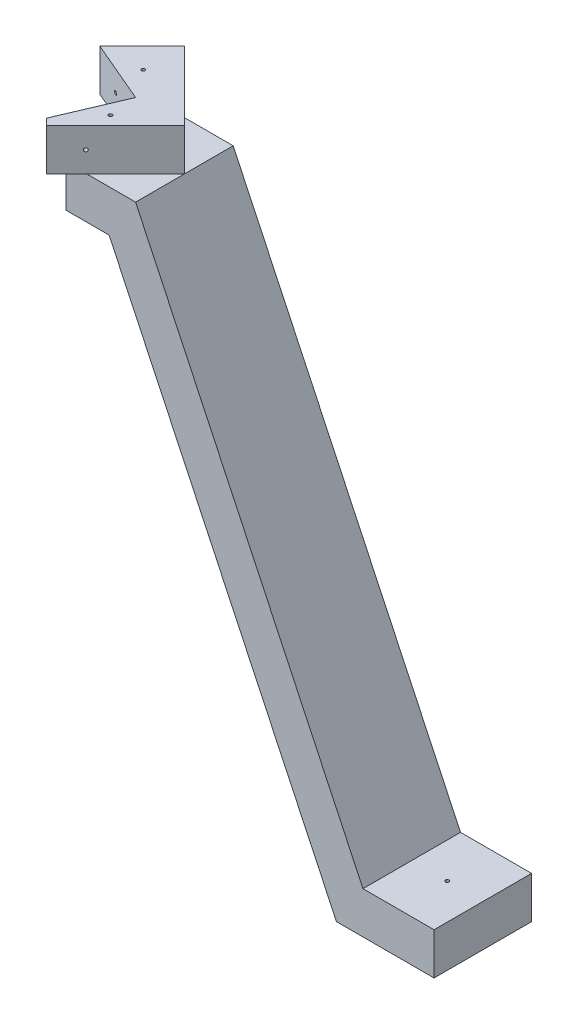
ISO-10303-21;
HEADER;
FILE_DESCRIPTION(('STEP AP214'),'2;1');
FILE_NAME('part.step','',(''),(''),'','','');
FILE_SCHEMA(('AUTOMOTIVE_DESIGN { 1 0 10303 214 1 1 1 1 }'));
ENDSEC;
DATA;
#1=APPLICATION_CONTEXT('core data for automotive mechanical design processes');
#2=APPLICATION_PROTOCOL_DEFINITION('international standard','automotive_design',2000,#1);
#3=PRODUCT_CONTEXT('',#1,'mechanical');
#4=PRODUCT('Part','Part','',(#3));
#5=PRODUCT_RELATED_PRODUCT_CATEGORY('part','',(#4));
#6=PRODUCT_DEFINITION_FORMATION('','',#4);
#7=PRODUCT_DEFINITION_CONTEXT('part definition',#1,'design');
#8=PRODUCT_DEFINITION('design','',#6,#7);
#9=PRODUCT_DEFINITION_SHAPE('','',#8);
#10=(LENGTH_UNIT() NAMED_UNIT(*) SI_UNIT(.MILLI.,.METRE.));
#11=(NAMED_UNIT(*) PLANE_ANGLE_UNIT() SI_UNIT($,.RADIAN.));
#12=(NAMED_UNIT(*) SI_UNIT($,.STERADIAN.) SOLID_ANGLE_UNIT());
#13=UNCERTAINTY_MEASURE_WITH_UNIT(LENGTH_MEASURE(1.E-05),#10,'distance_accuracy_value','');
#14=(GEOMETRIC_REPRESENTATION_CONTEXT(3) GLOBAL_UNCERTAINTY_ASSIGNED_CONTEXT((#13)) GLOBAL_UNIT_ASSIGNED_CONTEXT((#10,
#11,#12)) REPRESENTATION_CONTEXT('',''));
#15=CARTESIAN_POINT('',(0.,0.,0.));
#16=DIRECTION('',(0.,0.,1.));
#17=DIRECTION('',(1.,0.,0.));
#18=AXIS2_PLACEMENT_3D('',#15,#16,#17);
#19=CARTESIAN_POINT('',(-183.025944468659,476.25,44.4499999999994));
#20=DIRECTION('',(0.,-1.,0.));
#21=DIRECTION('',(0.,0.,-0.999999999999999));
#22=AXIS2_PLACEMENT_3D('',#19,#20,#21);
#23=PLANE('',#22);
#24=DIRECTION('',(-0.707106781186549,0.,0.707106781186546));
#25=VECTOR('',#24,1.);
#26=CARTESIAN_POINT('',(-308.749530163627,476.25,-2.4980018054066E-13));
#27=LINE('',#26,#25);
#28=CARTESIAN_POINT('',(-264.299530163627,476.25,-44.45));
#29=VERTEX_POINT('',#28);
#30=CARTESIAN_POINT('',(-271.925944468659,476.25,-36.8235856949682));
#31=VERTEX_POINT('',#30);
#32=EDGE_CURVE('E50',#29,#31,#27,.T.);
#33=ORIENTED_EDGE('',*,*,#32,.F.);
#34=DIRECTION('',(-0.999999999999999,0.,0.));
#35=VECTOR('',#34,1.);
#36=CARTESIAN_POINT('',(-183.025944468659,476.25,-44.45));
#37=LINE('',#36,#35);
#38=CARTESIAN_POINT('',(-271.925944468659,476.25,-44.45));
#39=VERTEX_POINT('',#38);
#40=EDGE_CURVE('E253',#29,#39,#37,.T.);
#41=ORIENTED_EDGE('',*,*,#40,.T.);
#42=DIRECTION('',(0.,0.,-0.999999999999999));
#43=VECTOR('',#42,1.);
#44=CARTESIAN_POINT('',(-271.925944468659,476.25,44.4499999999997));
#45=LINE('',#44,#43);
#46=EDGE_CURVE('E270',#31,#39,#45,.T.);
#47=ORIENTED_EDGE('',*,*,#46,.F.);
#48=EDGE_LOOP('',(#33,#41,#47));
#49=FACE_BOUND('',#48,.T.);
#50=ADVANCED_FACE('F36',(#49),#23,.F.);
#51=DIRECTION('',(-0.707106781186549,0.,-0.707106781186545));
#52=VECTOR('',#51,1.);
#53=CARTESIAN_POINT('',(-245.887737316143,476.25,-62.8617928474839));
#54=LINE('',#53,#52);
#55=CARTESIAN_POINT('',(-183.025944468659,476.25,-1.94289029309402E-13));
#56=VERTEX_POINT('',#55);
#57=CARTESIAN_POINT('',(-227.475944468659,476.25,-44.4500000000003));
#58=VERTEX_POINT('',#57);
#59=EDGE_CURVE('E66',#56,#58,#54,.T.);
#60=ORIENTED_EDGE('',*,*,#59,.F.);
#61=DIRECTION('',(0.,0.,-0.999999999999999));
#62=VECTOR('',#61,1.);
#63=CARTESIAN_POINT('',(-183.025944468659,476.25,44.4499999999994));
#64=LINE('',#63,#62);
#65=CARTESIAN_POINT('',(-183.025944468659,476.25,-44.45));
#66=VERTEX_POINT('',#65);
#67=EDGE_CURVE('E273',#56,#66,#64,.T.);
#68=ORIENTED_EDGE('',*,*,#67,.T.);
#69=EDGE_CURVE('E254',#66,#58,#37,.T.);
#70=ORIENTED_EDGE('',*,*,#69,.T.);
#71=EDGE_LOOP('',(#60,#68,#70));
#72=FACE_BOUND('',#71,.T.);
#73=ADVANCED_FACE('F370',(#72),#23,.F.);
#74=DIRECTION('',(0.707106781186549,0.,-0.707106781186546));
#75=VECTOR('',#74,1.);
#76=CARTESIAN_POINT('',(-183.025944468659,476.25,-3.05311331771918E-13));
#77=LINE('',#76,#75);
#78=CARTESIAN_POINT('',(-227.475944468659,476.25,44.4499999999997));
#79=VERTEX_POINT('',#78);
#80=EDGE_CURVE('E209',#79,#56,#77,.T.);
#81=ORIENTED_EDGE('',*,*,#80,.F.);
#82=DIRECTION('',(-0.999999999999999,0.,0.));
#83=VECTOR('',#82,1.);
#84=CARTESIAN_POINT('',(-183.025944468659,476.25,44.4499999999994));
#85=LINE('',#84,#83);
#86=CARTESIAN_POINT('',(-183.025944468659,476.25,44.4499999999994));
#87=VERTEX_POINT('',#86);
#88=EDGE_CURVE('E237',#87,#79,#85,.T.);
#89=ORIENTED_EDGE('',*,*,#88,.F.);
#90=EDGE_CURVE('E274',#87,#56,#64,.T.);
#91=ORIENTED_EDGE('',*,*,#90,.T.);
#92=EDGE_LOOP('',(#81,#89,#91));
#93=FACE_BOUND('',#92,.T.);
#94=ADVANCED_FACE('F365',(#93),#23,.F.);
#95=CARTESIAN_POINT('',(88.9,0.,44.45));
#96=DIRECTION('',(0.,1.,0.));
#97=DIRECTION('',(0.,0.,0.999999999999999));
#98=AXIS2_PLACEMENT_3D('',#95,#96,#97);
#99=PLANE('',#98);
#100=CARTESIAN_POINT('',(56.5151055313409,0.,0.));
#101=DIRECTION('',(0.,1.,0.));
#102=DIRECTION('',(0.,0.,0.999999999999999));
#103=AXIS2_PLACEMENT_3D('',#100,#101,#102);
#104=CIRCLE('',#103,1.58749999999999);
#105=CARTESIAN_POINT('',(56.5151055313409,0.,1.58749999999993));
#106=VERTEX_POINT('',#105);
#107=EDGE_CURVE('E222',#106,#106,#104,.T.);
#108=ORIENTED_EDGE('',*,*,#107,.T.);
#109=EDGE_LOOP('',(#108));
#110=FACE_BOUND('',#109,.T.);
#111=DIRECTION('',(0.999999999999999,0.,0.));
#112=VECTOR('',#111,1.);
#113=CARTESIAN_POINT('',(88.9,0.,-44.45));
#114=LINE('',#113,#112);
#115=CARTESIAN_POINT('',(2.22044604925031E-13,0.,-44.45));
#116=VERTEX_POINT('',#115);
#117=CARTESIAN_POINT('',(88.9,0.,-44.45));
#118=VERTEX_POINT('',#117);
#119=EDGE_CURVE('E225',#116,#118,#114,.T.);
#120=ORIENTED_EDGE('',*,*,#119,.T.);
#121=DIRECTION('',(0.,0.,-0.999999999999999));
#122=VECTOR('',#121,1.);
#123=CARTESIAN_POINT('',(88.9,0.,44.45));
#124=LINE('',#123,#122);
#125=CARTESIAN_POINT('',(88.9,0.,44.45));
#126=VERTEX_POINT('',#125);
#127=EDGE_CURVE('E283',#126,#118,#124,.T.);
#128=ORIENTED_EDGE('',*,*,#127,.F.);
#129=DIRECTION('',(0.999999999999999,0.,0.));
#130=VECTOR('',#129,1.);
#131=CARTESIAN_POINT('',(88.9,0.,44.45));
#132=LINE('',#131,#130);
#133=CARTESIAN_POINT('',(1.11022302462516E-13,0.,44.4499999999998));
#134=VERTEX_POINT('',#133);
#135=EDGE_CURVE('E226',#134,#126,#132,.T.);
#136=ORIENTED_EDGE('',*,*,#135,.F.);
#137=DIRECTION('',(0.,0.,-0.999999999999999));
#138=VECTOR('',#137,1.);
#139=CARTESIAN_POINT('',(1.11022302462516E-13,0.,44.4499999999998));
#140=LINE('',#139,#138);
#141=EDGE_CURVE('E243',#134,#116,#140,.T.);
#142=ORIENTED_EDGE('',*,*,#141,.T.);
#143=EDGE_LOOP('',(#120,#128,#136,#142));
#144=FACE_BOUND('',#143,.T.);
#145=ADVANCED_FACE('F38',(#110,#144),#99,.F.);
#146=CARTESIAN_POINT('',(88.9,38.0999999999997,44.45));
#147=DIRECTION('',(-0.999999999999999,0.,0.));
#148=DIRECTION('',(0.,0.,0.999999999999999));
#149=AXIS2_PLACEMENT_3D('',#146,#147,#148);
#150=PLANE('',#149);
#151=DIRECTION('',(0.,1.,0.));
#152=VECTOR('',#151,1.);
#153=CARTESIAN_POINT('',(88.9,38.0999999999997,-44.45));
#154=LINE('',#153,#152);
#155=CARTESIAN_POINT('',(88.9,38.0999999999997,-44.45));
#156=VERTEX_POINT('',#155);
#157=EDGE_CURVE('E246',#118,#156,#154,.T.);
#158=ORIENTED_EDGE('',*,*,#157,.T.);
#159=DIRECTION('',(0.,0.,-0.999999999999999));
#160=VECTOR('',#159,1.);
#161=CARTESIAN_POINT('',(88.9,38.0999999999997,44.45));
#162=LINE('',#161,#160);
#163=CARTESIAN_POINT('',(88.9,38.0999999999997,44.45));
#164=VERTEX_POINT('',#163);
#165=EDGE_CURVE('E280',#164,#156,#162,.T.);
#166=ORIENTED_EDGE('',*,*,#165,.F.);
#167=DIRECTION('',(0.,1.,0.));
#168=VECTOR('',#167,1.);
#169=CARTESIAN_POINT('',(88.9,38.0999999999997,44.45));
#170=LINE('',#169,#168);
#171=EDGE_CURVE('E229',#126,#164,#170,.T.);
#172=ORIENTED_EDGE('',*,*,#171,.F.);
#173=ORIENTED_EDGE('',*,*,#127,.T.);
#174=EDGE_LOOP('',(#158,#166,#172,#173));
#175=FACE_BOUND('',#174,.T.);
#176=ADVANCED_FACE('F402',(#175),#150,.F.);
#177=CARTESIAN_POINT('',(24.1302110626818,38.1,44.45));
#178=DIRECTION('',(0.,-1.,0.));
#179=DIRECTION('',(0.,0.,-0.999999999999999));
#180=AXIS2_PLACEMENT_3D('',#177,#178,#179);
#181=PLANE('',#180);
#182=CARTESIAN_POINT('',(56.5151055313409,38.0999999999997,0.));
#183=DIRECTION('',(0.,1.,0.));
#184=DIRECTION('',(0.,0.,0.999999999999999));
#185=AXIS2_PLACEMENT_3D('',#182,#183,#184);
#186=CIRCLE('',#185,1.58749999999999);
#187=CARTESIAN_POINT('',(56.5151055313409,38.0999999999997,1.58749999999993));
#188=VERTEX_POINT('',#187);
#189=EDGE_CURVE('E219',#188,#188,#186,.T.);
#190=ORIENTED_EDGE('',*,*,#189,.F.);
#191=EDGE_LOOP('',(#190));
#192=FACE_BOUND('',#191,.T.);
#193=DIRECTION('',(-0.999999999999999,0.,0.));
#194=VECTOR('',#193,1.);
#195=CARTESIAN_POINT('',(24.1302110626818,38.1,-44.45));
#196=LINE('',#195,#194);
#197=CARTESIAN_POINT('',(24.1302110626818,38.1,-44.45));
#198=VERTEX_POINT('',#197);
#199=EDGE_CURVE('E248',#156,#198,#196,.T.);
#200=ORIENTED_EDGE('',*,*,#199,.T.);
#201=DIRECTION('',(0.,0.,-0.999999999999999));
#202=VECTOR('',#201,1.);
#203=CARTESIAN_POINT('',(24.1302110626818,38.1,44.45));
#204=LINE('',#203,#202);
#205=CARTESIAN_POINT('',(24.1302110626818,38.1,44.45));
#206=VERTEX_POINT('',#205);
#207=EDGE_CURVE('E277',#206,#198,#204,.T.);
#208=ORIENTED_EDGE('',*,*,#207,.F.);
#209=DIRECTION('',(-0.999999999999999,0.,0.));
#210=VECTOR('',#209,1.);
#211=CARTESIAN_POINT('',(24.1302110626818,38.1,44.45));
#212=LINE('',#211,#210);
#213=EDGE_CURVE('E232',#164,#206,#212,.T.);
#214=ORIENTED_EDGE('',*,*,#213,.F.);
#215=ORIENTED_EDGE('',*,*,#165,.T.);
#216=EDGE_LOOP('',(#200,#208,#214,#215));
#217=FACE_BOUND('',#216,.T.);
#218=ADVANCED_FACE('F407',(#192,#217),#181,.F.);
#219=CARTESIAN_POINT('',(-183.025944468659,476.25,44.4499999999994));
#220=DIRECTION('',(-0.904047789169114,-0.427431392036704,0.));
#221=DIRECTION('',(0.427431392036705,-0.904047789169115,0.));
#222=AXIS2_PLACEMENT_3D('',#219,#220,#221);
#223=PLANE('',#222);
#224=DIRECTION('',(-0.427431392036705,0.904047789169115,0.));
#225=VECTOR('',#224,1.);
#226=CARTESIAN_POINT('',(-183.025944468659,476.25,-44.45));
#227=LINE('',#226,#225);
#228=EDGE_CURVE('E250',#198,#66,#227,.T.);
#229=ORIENTED_EDGE('',*,*,#228,.T.);
#230=ORIENTED_EDGE('',*,*,#67,.F.);
#231=ORIENTED_EDGE('',*,*,#90,.F.);
#232=DIRECTION('',(-0.427431392036705,0.904047789169115,0.));
#233=VECTOR('',#232,1.);
#234=CARTESIAN_POINT('',(-183.025944468659,476.25,44.4499999999994));
#235=LINE('',#234,#233);
#236=EDGE_CURVE('E234',#206,#87,#235,.T.);
#237=ORIENTED_EDGE('',*,*,#236,.F.);
#238=ORIENTED_EDGE('',*,*,#207,.T.);
#239=EDGE_LOOP('',(#229,#230,#231,#237,#238));
#240=FACE_BOUND('',#239,.T.);
#241=ADVANCED_FACE('F367',(#240),#223,.F.);
#242=CARTESIAN_POINT('',(-271.925944468659,476.25,44.4499999999997));
#243=DIRECTION('',(0.999999999999999,0.,0.));
#244=DIRECTION('',(0.,1.,0.));
#245=AXIS2_PLACEMENT_3D('',#242,#243,#244);
#246=PLANE('',#245);
#247=DIRECTION('',(0.,0.,-0.999999999999999));
#248=VECTOR('',#247,1.);
#249=CARTESIAN_POINT('',(-271.925944468659,438.15,44.4499999999995));
#250=LINE('',#249,#248);
#251=CARTESIAN_POINT('',(-271.925944468659,438.15,-18.9769560653855));
#252=VERTEX_POINT('',#251);
#253=CARTESIAN_POINT('',(-271.925944468659,438.15,-44.4500000000001));
#254=VERTEX_POINT('',#253);
#255=EDGE_CURVE('E268',#252,#254,#250,.T.);
#256=ORIENTED_EDGE('',*,*,#255,.F.);
#257=DIRECTION('',(0.,1.,0.));
#258=VECTOR('',#257,1.);
#259=CARTESIAN_POINT('',(-271.925944468659,476.25,-18.9769560653854));
#260=LINE('',#259,#258);
#261=CARTESIAN_POINT('',(-271.925944468659,476.25,-18.9769560653852));
#262=VERTEX_POINT('',#261);
#263=EDGE_CURVE('E167',#252,#262,#260,.T.);
#264=ORIENTED_EDGE('',*,*,#263,.T.);
#265=EDGE_CURVE('E271',#262,#31,#45,.T.);
#266=ORIENTED_EDGE('',*,*,#265,.T.);
#267=ORIENTED_EDGE('',*,*,#46,.T.);
#268=DIRECTION('',(0.,-1.,0.));
#269=VECTOR('',#268,1.);
#270=CARTESIAN_POINT('',(-271.925944468659,476.25,-44.45));
#271=LINE('',#270,#269);
#272=EDGE_CURVE('E256',#39,#254,#271,.T.);
#273=ORIENTED_EDGE('',*,*,#272,.T.);
#274=EDGE_LOOP('',(#256,#264,#266,#267,#273));
#275=FACE_BOUND('',#274,.T.);
#276=ADVANCED_FACE('F342',(#275),#246,.F.);
#277=CARTESIAN_POINT('',(-271.925944468659,438.15,44.4499999999995));
#278=DIRECTION('',(0.,1.,0.));
#279=DIRECTION('',(-0.999999999999999,0.,0.));
#280=AXIS2_PLACEMENT_3D('',#277,#278,#279);
#281=PLANE('',#280);
#282=CARTESIAN_POINT('',(-224.936155531341,438.15,25.3999999999997));
#283=DIRECTION('',(0.,-1.,0.));
#284=DIRECTION('',(0.,0.,-0.999999999999999));
#285=AXIS2_PLACEMENT_3D('',#282,#283,#284);
#286=CIRCLE('',#285,1.58749999999999);
#287=CARTESIAN_POINT('',(-224.936155531341,438.15,23.8124999999997));
#288=VERTEX_POINT('',#287);
#289=EDGE_CURVE('E516',#288,#288,#286,.T.);
#290=ORIENTED_EDGE('',*,*,#289,.F.);
#291=EDGE_LOOP('',(#290));
#292=FACE_BOUND('',#291,.T.);
#293=CARTESIAN_POINT('',(-245.887737316143,438.15,-25.4000000000002));
#294=DIRECTION('',(0.,-1.,0.));
#295=DIRECTION('',(0.,0.,-0.999999999999999));
#296=AXIS2_PLACEMENT_3D('',#293,#294,#295);
#297=CIRCLE('',#296,1.58749999999999);
#298=CARTESIAN_POINT('',(-245.887737316143,438.15,-26.9875000000002));
#299=VERTEX_POINT('',#298);
#300=EDGE_CURVE('E518',#299,#299,#297,.T.);
#301=ORIENTED_EDGE('',*,*,#300,.F.);
#302=EDGE_LOOP('',(#301));
#303=FACE_BOUND('',#302,.T.);
#304=DIRECTION('',(0.999999999999999,0.,0.));
#305=VECTOR('',#304,1.);
#306=CARTESIAN_POINT('',(-271.925944468659,438.15,44.4499999999995));
#307=LINE('',#306,#305);
#308=CARTESIAN_POINT('',(-246.452900534044,438.15,44.4499999999996));
#309=VERTEX_POINT('',#308);
#310=CARTESIAN_POINT('',(-207.156155531341,438.15,44.4499999999999));
#311=VERTEX_POINT('',#310);
#312=EDGE_CURVE('E181',#309,#311,#307,.T.);
#313=ORIENTED_EDGE('',*,*,#312,.F.);
#314=DIRECTION('',(0.392642119385448,0.,-0.919691342834378));
#315=VECTOR('',#314,1.);
#316=CARTESIAN_POINT('',(-250.380024540678,438.15,53.648559636931));
#317=LINE('',#316,#315);
#318=CARTESIAN_POINT('',(-227.475944468659,438.15,0.));
#319=VERTEX_POINT('',#318);
#320=EDGE_CURVE('E174',#309,#319,#317,.T.);
#321=ORIENTED_EDGE('',*,*,#320,.T.);
#322=DIRECTION('',(-0.91969134283438,0.,-0.392642119385445));
#323=VECTOR('',#322,1.);
#324=CARTESIAN_POINT('',(-249.02186439664,438.15,-9.19855963693189));
#325=LINE('',#324,#323);
#326=EDGE_CURVE('E163',#319,#252,#325,.T.);
#327=ORIENTED_EDGE('',*,*,#326,.T.);
#328=ORIENTED_EDGE('',*,*,#255,.T.);
#329=DIRECTION('',(0.999999999999999,0.,0.));
#330=VECTOR('',#329,1.);
#331=CARTESIAN_POINT('',(-271.925944468659,438.15,-44.4500000000001));
#332=LINE('',#331,#330);
#333=CARTESIAN_POINT('',(-207.156155531341,438.15,-44.4500000000003));
#334=VERTEX_POINT('',#333);
#335=EDGE_CURVE('E260',#254,#334,#332,.T.);
#336=ORIENTED_EDGE('',*,*,#335,.T.);
#337=DIRECTION('',(0.,0.,-0.999999999999999));
#338=VECTOR('',#337,1.);
#339=CARTESIAN_POINT('',(-207.156155531341,438.15,44.4499999999999));
#340=LINE('',#339,#338);
#341=EDGE_CURVE('E265',#311,#334,#340,.T.);
#342=ORIENTED_EDGE('',*,*,#341,.F.);
#343=EDGE_LOOP('',(#313,#321,#327,#328,#336,#342));
#344=FACE_BOUND('',#343,.T.);
#345=ADVANCED_FACE('F179',(#292,#303,#344),#281,.F.);
#346=CARTESIAN_POINT('',(1.11022302462516E-13,0.,44.4499999999998));
#347=DIRECTION('',(0.904047789169115,0.427431392036704,0.));
#348=DIRECTION('',(-0.427431392036705,0.904047789169115,0.));
#349=AXIS2_PLACEMENT_3D('',#346,#347,#348);
#350=PLANE('',#349);
#351=DIRECTION('',(0.427431392036705,-0.904047789169115,0.));
#352=VECTOR('',#351,1.);
#353=CARTESIAN_POINT('',(2.22044604925031E-13,0.,-44.45));
#354=LINE('',#353,#352);
#355=EDGE_CURVE('E230',#334,#116,#354,.T.);
#356=ORIENTED_EDGE('',*,*,#355,.T.);
#357=ORIENTED_EDGE('',*,*,#141,.F.);
#358=DIRECTION('',(0.427431392036705,-0.904047789169115,0.));
#359=VECTOR('',#358,1.);
#360=CARTESIAN_POINT('',(1.11022302462516E-13,0.,44.4499999999998));
#361=LINE('',#360,#359);
#362=EDGE_CURVE('E241',#311,#134,#361,.T.);
#363=ORIENTED_EDGE('',*,*,#362,.F.);
#364=ORIENTED_EDGE('',*,*,#341,.T.);
#365=EDGE_LOOP('',(#356,#357,#363,#364));
#366=FACE_BOUND('',#365,.T.);
#367=ADVANCED_FACE('F350',(#366),#350,.F.);
#368=CARTESIAN_POINT('',(1.11022302462516E-13,0.,44.4499999999998));
#369=DIRECTION('',(0.,0.,0.999999999999999));
#370=DIRECTION('',(0.999999999999999,0.,0.));
#371=AXIS2_PLACEMENT_3D('',#368,#369,#370);
#372=PLANE('',#371);
#373=DIRECTION('',(0.,1.,0.));
#374=VECTOR('',#373,1.);
#375=CARTESIAN_POINT('',(-246.452900534044,0.,44.4500000000001));
#376=LINE('',#375,#374);
#377=CARTESIAN_POINT('',(-246.452900534044,476.25,44.4499999999996));
#378=VERTEX_POINT('',#377);
#379=EDGE_CURVE('E183',#309,#378,#376,.T.);
#380=ORIENTED_EDGE('',*,*,#379,.F.);
#381=ORIENTED_EDGE('',*,*,#312,.T.);
#382=ORIENTED_EDGE('',*,*,#362,.T.);
#383=ORIENTED_EDGE('',*,*,#135,.T.);
#384=ORIENTED_EDGE('',*,*,#171,.T.);
#385=ORIENTED_EDGE('',*,*,#213,.T.);
#386=ORIENTED_EDGE('',*,*,#236,.T.);
#387=ORIENTED_EDGE('',*,*,#88,.T.);
#388=EDGE_CURVE('E236',#79,#378,#85,.T.);
#389=ORIENTED_EDGE('',*,*,#388,.T.);
#390=EDGE_LOOP('',(#380,#381,#382,#383,#384,#385,#386,#387,#389));
#391=FACE_BOUND('',#390,.T.);
#392=ADVANCED_FACE('F359',(#391),#372,.T.);
#393=CARTESIAN_POINT('',(2.22044604925031E-13,0.,-44.45));
#394=DIRECTION('',(0.,0.,0.999999999999999));
#395=DIRECTION('',(0.999999999999999,0.,0.));
#396=AXIS2_PLACEMENT_3D('',#393,#394,#395);
#397=PLANE('',#396);
#398=ORIENTED_EDGE('',*,*,#119,.F.);
#399=ORIENTED_EDGE('',*,*,#355,.F.);
#400=ORIENTED_EDGE('',*,*,#335,.F.);
#401=ORIENTED_EDGE('',*,*,#272,.F.);
#402=ORIENTED_EDGE('',*,*,#40,.F.);
#403=EDGE_CURVE('E257',#58,#29,#37,.T.);
#404=ORIENTED_EDGE('',*,*,#403,.F.);
#405=ORIENTED_EDGE('',*,*,#69,.F.);
#406=ORIENTED_EDGE('',*,*,#228,.F.);
#407=ORIENTED_EDGE('',*,*,#199,.F.);
#408=ORIENTED_EDGE('',*,*,#157,.F.);
#409=EDGE_LOOP('',(#398,#399,#400,#401,#402,#404,#405,#406,#407,#408));
#410=FACE_BOUND('',#409,.T.);
#411=ADVANCED_FACE('F353',(#410),#397,.F.);
#412=CARTESIAN_POINT('',(56.5151055313409,38.0999999999997,0.));
#413=DIRECTION('',(0.,1.,0.));
#414=DIRECTION('',(0.,0.,0.999999999999999));
#415=AXIS2_PLACEMENT_3D('',#412,#413,#414);
#416=CYLINDRICAL_SURFACE('',#415,1.58749999999999);
#417=ORIENTED_EDGE('',*,*,#107,.F.);
#418=EDGE_LOOP('',(#417));
#419=FACE_BOUND('',#418,.T.);
#420=ORIENTED_EDGE('',*,*,#189,.T.);
#421=EDGE_LOOP('',(#420));
#422=FACE_BOUND('',#421,.T.);
#423=ADVANCED_FACE('F411',(#419,#422),#416,.F.);
#424=CARTESIAN_POINT('',(1.11022302462516E-13,476.25,-3.60822483003176E-13));
#425=DIRECTION('',(0.,-1.,0.));
#426=DIRECTION('',(0.,0.,-0.999999999999999));
#427=AXIS2_PLACEMENT_3D('',#424,#425,#426);
#428=PLANE('',#427);
#429=DIRECTION('',(0.91969134283438,0.,0.392642119385445));
#430=VECTOR('',#429,1.);
#431=CARTESIAN_POINT('',(-35.0694736266145,476.25,82.1437377697471));
#432=LINE('',#431,#430);
#433=CARTESIAN_POINT('',(-284.432972020434,476.25,-24.316558143194));
#434=VERTEX_POINT('',#433);
#435=EDGE_CURVE('E308',#434,#262,#432,.T.);
#436=ORIENTED_EDGE('',*,*,#435,.F.);
#437=EDGE_CURVE('E182',#31,#434,#27,.T.);
#438=ORIENTED_EDGE('',*,*,#437,.F.);
#439=ORIENTED_EDGE('',*,*,#265,.F.);
#440=EDGE_LOOP('',(#436,#438,#439));
#441=FACE_BOUND('',#440,.T.);
#442=ADVANCED_FACE('F340',(#441),#428,.T.);
#443=DIRECTION('',(-0.392642119385448,0.,0.919691342834378));
#444=VECTOR('',#443,1.);
#445=CARTESIAN_POINT('',(-192.406470842044,476.25,-82.1437377697482));
#446=LINE('',#445,#444);
#447=CARTESIAN_POINT('',(-251.792502611853,476.25,56.9570275517742));
#448=VERTEX_POINT('',#447);
#449=EDGE_CURVE('E188',#378,#448,#446,.T.);
#450=ORIENTED_EDGE('',*,*,#449,.F.);
#451=ORIENTED_EDGE('',*,*,#388,.F.);
#452=CARTESIAN_POINT('',(-245.887737316143,476.25,62.8617928474837));
#453=VERTEX_POINT('',#452);
#454=EDGE_CURVE('E205',#453,#79,#77,.T.);
#455=ORIENTED_EDGE('',*,*,#454,.F.);
#456=DIRECTION('',(0.707106781186549,0.,0.707106781186546));
#457=VECTOR('',#456,1.);
#458=CARTESIAN_POINT('',(-245.887737316143,476.25,62.8617928474837));
#459=LINE('',#458,#457);
#460=EDGE_CURVE('E203',#448,#453,#459,.T.);
#461=ORIENTED_EDGE('',*,*,#460,.F.);
#462=EDGE_LOOP('',(#450,#451,#455,#461));
#463=FACE_BOUND('',#462,.T.);
#464=ADVANCED_FACE('F322',(#463),#428,.T.);
#465=CARTESIAN_POINT('',(-308.749530163627,514.35,-2.4980018054066E-13));
#466=DIRECTION('',(0.707106781186546,0.,0.707106781186549));
#467=DIRECTION('',(0.707106781186549,0.,-0.707106781186546));
#468=AXIS2_PLACEMENT_3D('',#465,#466,#467);
#469=PLANE('',#468);
#470=ORIENTED_EDGE('',*,*,#437,.T.);
#471=DIRECTION('',(0.,1.,0.));
#472=VECTOR('',#471,1.);
#473=CARTESIAN_POINT('',(-284.432972020434,514.35,-24.3165581431941));
#474=LINE('',#473,#472);
#475=CARTESIAN_POINT('',(-284.432972020434,514.35,-24.3165581431941));
#476=VERTEX_POINT('',#475);
#477=EDGE_CURVE('E176',#434,#476,#474,.T.);
#478=ORIENTED_EDGE('',*,*,#477,.T.);
#479=DIRECTION('',(-0.707106781186549,0.,0.707106781186546));
#480=VECTOR('',#479,1.);
#481=CARTESIAN_POINT('',(-308.749530163627,514.35,-2.4980018054066E-13));
#482=LINE('',#481,#480);
#483=CARTESIAN_POINT('',(-245.887737316143,514.35,-62.8617928474842));
#484=VERTEX_POINT('',#483);
#485=EDGE_CURVE('E192',#484,#476,#482,.T.);
#486=ORIENTED_EDGE('',*,*,#485,.F.);
#487=DIRECTION('',(0.,-1.,0.));
#488=VECTOR('',#487,1.);
#489=CARTESIAN_POINT('',(-245.887737316143,514.35,-62.8617928474842));
#490=LINE('',#489,#488);
#491=CARTESIAN_POINT('',(-245.887737316143,476.25,-62.8617928474839));
#492=VERTEX_POINT('',#491);
#493=EDGE_CURVE('E200',#484,#492,#490,.T.);
#494=ORIENTED_EDGE('',*,*,#493,.T.);
#495=EDGE_CURVE('E186',#492,#29,#27,.T.);
#496=ORIENTED_EDGE('',*,*,#495,.T.);
#497=ORIENTED_EDGE('',*,*,#32,.T.);
#498=EDGE_LOOP('',(#470,#478,#486,#494,#496,#497));
#499=FACE_BOUND('',#498,.T.);
#500=ADVANCED_FACE('F335',(#499),#469,.F.);
#501=CARTESIAN_POINT('',(-245.887737316143,514.35,62.8617928474836));
#502=DIRECTION('',(0.707106781186546,0.,-0.707106781186549));
#503=DIRECTION('',(-0.707106781186549,0.,-0.707106781186546));
#504=AXIS2_PLACEMENT_3D('',#501,#502,#503);
#505=PLANE('',#504);
#506=DIRECTION('',(0.707106781186549,0.,0.707106781186546));
#507=VECTOR('',#506,1.);
#508=CARTESIAN_POINT('',(-245.887737316143,514.35,62.8617928474836));
#509=LINE('',#508,#507);
#510=CARTESIAN_POINT('',(-251.792502611853,514.35,56.9570275517741));
#511=VERTEX_POINT('',#510);
#512=CARTESIAN_POINT('',(-245.887737316143,514.35,62.8617928474836));
#513=VERTEX_POINT('',#512);
#514=EDGE_CURVE('E195',#511,#513,#509,.T.);
#515=ORIENTED_EDGE('',*,*,#514,.F.);
#516=DIRECTION('',(0.,-1.,0.));
#517=VECTOR('',#516,1.);
#518=CARTESIAN_POINT('',(-251.792502611853,514.35,56.9570275517741));
#519=LINE('',#518,#517);
#520=EDGE_CURVE('E171',#511,#448,#519,.T.);
#521=ORIENTED_EDGE('',*,*,#520,.T.);
#522=ORIENTED_EDGE('',*,*,#460,.T.);
#523=DIRECTION('',(0.,-1.,0.));
#524=VECTOR('',#523,1.);
#525=CARTESIAN_POINT('',(-245.887737316143,514.35,62.8617928474836));
#526=LINE('',#525,#524);
#527=EDGE_CURVE('E216',#513,#453,#526,.T.);
#528=ORIENTED_EDGE('',*,*,#527,.F.);
#529=EDGE_LOOP('',(#515,#521,#522,#528));
#530=FACE_BOUND('',#529,.T.);
#531=ADVANCED_FACE('F319',(#530),#505,.F.);
#532=CARTESIAN_POINT('',(-183.025944468659,514.35,-3.05311331771918E-13));
#533=DIRECTION('',(-0.707106781186546,0.,-0.707106781186549));
#534=DIRECTION('',(-0.707106781186549,0.,0.707106781186546));
#535=AXIS2_PLACEMENT_3D('',#532,#533,#534);
#536=PLANE('',#535);
#537=CARTESIAN_POINT('',(-227.927225074005,495.3,44.9012806053453));
#538=DIRECTION('',(0.707106781186546,0.,0.707106781186549));
#539=DIRECTION('',(0.707106781186549,0.,-0.707106781186546));
#540=AXIS2_PLACEMENT_3D('',#537,#538,#539);
#541=CIRCLE('',#540,1.58749999999996);
#542=CARTESIAN_POINT('',(-226.804693058871,495.3,43.7787485902116));
#543=VERTEX_POINT('',#542);
#544=EDGE_CURVE('E288',#543,#543,#541,.T.);
#545=ORIENTED_EDGE('',*,*,#544,.F.);
#546=EDGE_LOOP('',(#545));
#547=FACE_BOUND('',#546,.T.);
#548=ORIENTED_EDGE('',*,*,#454,.T.);
#549=ORIENTED_EDGE('',*,*,#80,.T.);
#550=DIRECTION('',(0.,-1.,0.));
#551=VECTOR('',#550,1.);
#552=CARTESIAN_POINT('',(-183.025944468659,514.35,-3.05311331771918E-13));
#553=LINE('',#552,#551);
#554=CARTESIAN_POINT('',(-183.025944468659,514.35,-3.05311331771918E-13));
#555=VERTEX_POINT('',#554);
#556=EDGE_CURVE('E213',#555,#56,#553,.T.);
#557=ORIENTED_EDGE('',*,*,#556,.F.);
#558=DIRECTION('',(0.707106781186549,0.,-0.707106781186546));
#559=VECTOR('',#558,1.);
#560=CARTESIAN_POINT('',(-183.025944468659,514.35,-3.05311331771918E-13));
#561=LINE('',#560,#559);
#562=EDGE_CURVE('E197',#513,#555,#561,.T.);
#563=ORIENTED_EDGE('',*,*,#562,.F.);
#564=ORIENTED_EDGE('',*,*,#527,.T.);
#565=EDGE_LOOP('',(#548,#549,#557,#563,#564));
#566=FACE_BOUND('',#565,.T.);
#567=ADVANCED_FACE('F325',(#547,#566),#536,.F.);
#568=CARTESIAN_POINT('',(-245.887737316143,514.35,-62.8617928474842));
#569=DIRECTION('',(-0.707106781186545,0.,0.707106781186549));
#570=DIRECTION('',(0.707106781186549,0.,0.707106781186545));
#571=AXIS2_PLACEMENT_3D('',#568,#569,#570);
#572=PLANE('',#571);
#573=CARTESIAN_POINT('',(-227.927225074005,495.3,-44.9012806053458));
#574=DIRECTION('',(0.707106781186546,0.,-0.707106781186549));
#575=DIRECTION('',(-0.707106781186549,0.,-0.707106781186546));
#576=AXIS2_PLACEMENT_3D('',#573,#574,#575);
#577=CIRCLE('',#576,1.58749999999996);
#578=CARTESIAN_POINT('',(-229.049757089139,495.3,-46.0238126204794));
#579=VERTEX_POINT('',#578);
#580=EDGE_CURVE('E291',#579,#579,#577,.T.);
#581=ORIENTED_EDGE('',*,*,#580,.F.);
#582=EDGE_LOOP('',(#581));
#583=FACE_BOUND('',#582,.T.);
#584=ORIENTED_EDGE('',*,*,#59,.T.);
#585=EDGE_CURVE('E208',#58,#492,#54,.T.);
#586=ORIENTED_EDGE('',*,*,#585,.T.);
#587=ORIENTED_EDGE('',*,*,#493,.F.);
#588=DIRECTION('',(-0.707106781186549,0.,-0.707106781186545));
#589=VECTOR('',#588,1.);
#590=CARTESIAN_POINT('',(-245.887737316143,514.35,-62.8617928474842));
#591=LINE('',#590,#589);
#592=EDGE_CURVE('E199',#555,#484,#591,.T.);
#593=ORIENTED_EDGE('',*,*,#592,.F.);
#594=ORIENTED_EDGE('',*,*,#556,.T.);
#595=EDGE_LOOP('',(#584,#586,#587,#593,#594));
#596=FACE_BOUND('',#595,.T.);
#597=ADVANCED_FACE('F377',(#583,#596),#572,.F.);
#598=CARTESIAN_POINT('',(1.11022302462516E-13,514.35,-3.60822483003176E-13));
#599=DIRECTION('',(0.,-1.,0.));
#600=DIRECTION('',(0.,0.,-0.999999999999999));
#601=AXIS2_PLACEMENT_3D('',#598,#599,#600);
#602=PLANE('',#601);
#603=CARTESIAN_POINT('',(-224.936155531341,514.35,25.3999999999996));
#604=DIRECTION('',(0.,-1.,0.));
#605=DIRECTION('',(0.,0.,-0.999999999999999));
#606=AXIS2_PLACEMENT_3D('',#603,#604,#605);
#607=CIRCLE('',#606,1.58749999999999);
#608=CARTESIAN_POINT('',(-224.936155531341,514.35,23.8124999999997));
#609=VERTEX_POINT('',#608);
#610=EDGE_CURVE('E513',#609,#609,#607,.T.);
#611=ORIENTED_EDGE('',*,*,#610,.T.);
#612=EDGE_LOOP('',(#611));
#613=FACE_BOUND('',#612,.T.);
#614=CARTESIAN_POINT('',(-245.887737316143,514.35,-25.4000000000002));
#615=DIRECTION('',(0.,-1.,0.));
#616=DIRECTION('',(0.,0.,-0.999999999999999));
#617=AXIS2_PLACEMENT_3D('',#614,#615,#616);
#618=CIRCLE('',#617,1.58749999999999);
#619=CARTESIAN_POINT('',(-245.887737316143,514.35,-26.9875000000002));
#620=VERTEX_POINT('',#619);
#621=EDGE_CURVE('E301',#620,#620,#618,.T.);
#622=ORIENTED_EDGE('',*,*,#621,.T.);
#623=EDGE_LOOP('',(#622));
#624=FACE_BOUND('',#623,.T.);
#625=DIRECTION('',(0.91969134283438,0.,0.392642119385445));
#626=VECTOR('',#625,1.);
#627=CARTESIAN_POINT('',(-35.0694736266145,514.35,82.1437377697471));
#628=LINE('',#627,#626);
#629=CARTESIAN_POINT('',(-227.475944468659,514.35,0.));
#630=VERTEX_POINT('',#629);
#631=EDGE_CURVE('E11',#476,#630,#628,.T.);
#632=ORIENTED_EDGE('',*,*,#631,.T.);
#633=DIRECTION('',(-0.392642119385448,0.,0.919691342834378));
#634=VECTOR('',#633,1.);
#635=CARTESIAN_POINT('',(-308.749530163627,514.35,190.368300990636));
#636=LINE('',#635,#634);
#637=EDGE_CURVE('E58',#630,#511,#636,.T.);
#638=ORIENTED_EDGE('',*,*,#637,.T.);
#639=ORIENTED_EDGE('',*,*,#514,.T.);
#640=ORIENTED_EDGE('',*,*,#562,.T.);
#641=ORIENTED_EDGE('',*,*,#592,.T.);
#642=ORIENTED_EDGE('',*,*,#485,.T.);
#643=EDGE_LOOP('',(#632,#638,#639,#640,#641,#642));
#644=FACE_BOUND('',#643,.T.);
#645=ADVANCED_FACE('F330',(#613,#624,#644),#602,.F.);
#646=ORIENTED_EDGE('',*,*,#585,.F.);
#647=ORIENTED_EDGE('',*,*,#403,.T.);
#648=ORIENTED_EDGE('',*,*,#495,.F.);
#649=EDGE_LOOP('',(#646,#647,#648));
#650=FACE_BOUND('',#649,.T.);
#651=ADVANCED_FACE('F375',(#650),#428,.T.);
#652=CARTESIAN_POINT('',(-308.749530163627,514.35,190.368300990636));
#653=DIRECTION('',(0.919691342834378,0.,0.392642119385448));
#654=DIRECTION('',(0.392642119385448,0.,-0.919691342834378));
#655=AXIS2_PLACEMENT_3D('',#652,#653,#654);
#656=PLANE('',#655);
#657=CARTESIAN_POINT('',(-241.045152498456,495.3,31.7833531808942));
#658=DIRECTION('',(0.919691342834378,0.,0.392642119385448));
#659=DIRECTION('',(-0.392642119385448,0.,0.919691342834378));
#660=AXIS2_PLACEMENT_3D('',#657,#658,#659);
#661=ELLIPSE('',#660,1.71074204453317,1.58749999999996);
#662=CARTESIAN_POINT('',(-241.716861880543,495.3,33.3567078290741));
#663=VERTEX_POINT('',#662);
#664=EDGE_CURVE('E286',#663,#663,#661,.T.);
#665=ORIENTED_EDGE('',*,*,#664,.T.);
#666=EDGE_LOOP('',(#665));
#667=FACE_BOUND('',#666,.T.);
#668=ORIENTED_EDGE('',*,*,#379,.T.);
#669=ORIENTED_EDGE('',*,*,#449,.T.);
#670=ORIENTED_EDGE('',*,*,#520,.F.);
#671=ORIENTED_EDGE('',*,*,#637,.F.);
#672=DIRECTION('',(0.,-1.,0.));
#673=VECTOR('',#672,1.);
#674=CARTESIAN_POINT('',(-227.475944468659,514.35,0.));
#675=LINE('',#674,#673);
#676=EDGE_CURVE('E165',#630,#319,#675,.T.);
#677=ORIENTED_EDGE('',*,*,#676,.T.);
#678=ORIENTED_EDGE('',*,*,#320,.F.);
#679=EDGE_LOOP('',(#668,#669,#670,#671,#677,#678));
#680=FACE_BOUND('',#679,.T.);
#681=ADVANCED_FACE('F173',(#667,#680),#656,.F.);
#682=CARTESIAN_POINT('',(-227.475944468659,514.35,0.));
#683=DIRECTION('',(0.392642119385445,0.,-0.91969134283438));
#684=DIRECTION('',(-0.91969134283438,0.,-0.392642119385445));
#685=AXIS2_PLACEMENT_3D('',#682,#683,#684);
#686=PLANE('',#685);
#687=CARTESIAN_POINT('',(-259.259297649554,495.3,-13.569208029797));
#688=DIRECTION('',(0.392642119385445,0.,-0.91969134283438));
#689=DIRECTION('',(0.919691342834381,0.,0.392642119385445));
#690=AXIS2_PLACEMENT_3D('',#687,#688,#689);
#691=ELLIPSE('',#690,1.71074204453317,1.58749999999996);
#692=CARTESIAN_POINT('',(-257.685943001374,495.3,-12.8974986477097));
#693=VERTEX_POINT('',#692);
#694=EDGE_CURVE('E289',#693,#693,#691,.T.);
#695=ORIENTED_EDGE('',*,*,#694,.T.);
#696=EDGE_LOOP('',(#695));
#697=FACE_BOUND('',#696,.T.);
#698=ORIENTED_EDGE('',*,*,#676,.F.);
#699=ORIENTED_EDGE('',*,*,#631,.F.);
#700=ORIENTED_EDGE('',*,*,#477,.F.);
#701=ORIENTED_EDGE('',*,*,#435,.T.);
#702=ORIENTED_EDGE('',*,*,#263,.F.);
#703=ORIENTED_EDGE('',*,*,#326,.F.);
#704=EDGE_LOOP('',(#698,#699,#700,#701,#702,#703));
#705=FACE_BOUND('',#704,.T.);
#706=ADVANCED_FACE('F164',(#697,#705),#686,.F.);
#707=CARTESIAN_POINT('',(-227.927225074005,495.3,44.9012806053453));
#708=DIRECTION('',(0.707106781186546,0.,0.707106781186549));
#709=DIRECTION('',(0.707106781186549,0.,-0.707106781186546));
#710=AXIS2_PLACEMENT_3D('',#707,#708,#709);
#711=CYLINDRICAL_SURFACE('',#710,1.58749999999996);
#712=ORIENTED_EDGE('',*,*,#544,.T.);
#713=EDGE_LOOP('',(#712));
#714=FACE_BOUND('',#713,.T.);
#715=ORIENTED_EDGE('',*,*,#664,.F.);
#716=EDGE_LOOP('',(#715));
#717=FACE_BOUND('',#716,.T.);
#718=ADVANCED_FACE('F477',(#714,#717),#711,.F.);
#719=CARTESIAN_POINT('',(-227.927225074005,495.3,-44.9012806053458));
#720=DIRECTION('',(0.707106781186546,0.,-0.707106781186549));
#721=DIRECTION('',(-0.707106781186549,0.,-0.707106781186546));
#722=AXIS2_PLACEMENT_3D('',#719,#720,#721);
#723=CYLINDRICAL_SURFACE('',#722,1.58749999999996);
#724=CARTESIAN_POINT('',(-245.887737316143,496.887156050003,-26.9875000000004));
#725=CARTESIAN_POINT('',(-245.976033227076,496.885854038784,-26.987491391966));
#726=CARTESIAN_POINT('',(-246.064375245721,496.880973706518,-26.9800937957222));
#727=CARTESIAN_POINT('',(-246.238540260125,496.867721762543,-26.950789694889));
#728=CARTESIAN_POINT('',(-246.324353159813,496.859337774138,-26.9288315922187));
#729=CARTESIAN_POINT('',(-246.49094922298,496.842526608144,-26.8710656317193));
#730=CARTESIAN_POINT('',(-246.571744766412,496.834099597309,-26.8352935746227));
#731=CARTESIAN_POINT('',(-246.726380358157,496.820019032571,-26.7507718412674));
#732=CARTESIAN_POINT('',(-246.800230154417,496.814361543427,-26.7020407315962));
#733=CARTESIAN_POINT('',(-246.939085393327,496.807630720748,-26.5927446032397));
#734=CARTESIAN_POINT('',(-247.004073570846,496.806566215566,-26.5321570281224));
#735=CARTESIAN_POINT('',(-247.123002676729,496.809396569839,-26.4010553016412));
#736=CARTESIAN_POINT('',(-247.176941455153,496.813292393389,-26.3305392229316));
#737=CARTESIAN_POINT('',(-247.270445143175,496.82455407444,-26.1845472743744));
#738=CARTESIAN_POINT('',(-247.310470765306,496.831785220506,-26.1093541298014));
#739=CARTESIAN_POINT('',(-247.378002816323,496.847459413895,-25.9536035607082));
#740=CARTESIAN_POINT('',(-247.405499331494,496.85590341397,-25.8730419459298));
#741=CARTESIAN_POINT('',(-247.448384628672,496.871561329526,-25.7041582454125));
#742=CARTESIAN_POINT('',(-247.463078825658,496.87868976574,-25.6156500982243));
#743=CARTESIAN_POINT('',(-247.477314155455,496.887397719629,-25.4371678788847));
#744=CARTESIAN_POINT('',(-247.476877163064,496.88898524401,-25.3471961108621));
#745=CARTESIAN_POINT('',(-247.462615499468,496.883438608292,-25.188254309511));
#746=CARTESIAN_POINT('',(-247.451712484366,496.878119903883,-25.118958208327));
#747=CARTESIAN_POINT('',(-247.421152461631,496.860058137712,-24.9833324918769));
#748=CARTESIAN_POINT('',(-247.401503402578,496.847321813998,-24.9170002430988));
#749=CARTESIAN_POINT('',(-247.354597130437,496.813218282819,-24.7891559408953));
#750=CARTESIAN_POINT('',(-247.327315296453,496.791823043018,-24.7276603253163));
#751=CARTESIAN_POINT('',(-247.267165526942,496.740028653156,-24.6115764851443));
#752=CARTESIAN_POINT('',(-247.234296551595,496.709627826286,-24.5569895496264));
#753=CARTESIAN_POINT('',(-247.16713296839,496.641972613889,-24.4583552894068));
#754=CARTESIAN_POINT('',(-247.132987269444,496.60512732972,-24.4139224368462));
#755=CARTESIAN_POINT('',(-247.063998409585,496.524493815652,-24.3325661180321));
#756=CARTESIAN_POINT('',(-247.029155048573,496.480703568191,-24.2956448410834));
#757=CARTESIAN_POINT('',(-246.957241205273,496.382386660079,-24.2256549983089));
#758=CARTESIAN_POINT('',(-246.920301141501,496.327222357216,-24.1933520036686));
#759=CARTESIAN_POINT('',(-246.850109282133,496.210805363901,-24.1366568640092));
#760=CARTESIAN_POINT('',(-246.816860347637,496.14954801933,-24.1122708278631));
#761=CARTESIAN_POINT('',(-246.751054724823,496.011764272051,-24.0670767306825));
#762=CARTESIAN_POINT('',(-246.719474814594,495.934368767812,-24.0474803238081));
#763=CARTESIAN_POINT('',(-246.666469162403,495.774641649414,-24.0162789173671));
#764=CARTESIAN_POINT('',(-246.645043861354,495.692309821097,-24.0046742647922));
#765=CARTESIAN_POINT('',(-246.613638435277,495.520896131195,-23.9880634336099));
#766=CARTESIAN_POINT('',(-246.60422163162,495.431677492844,-23.9833804872699));
#767=CARTESIAN_POINT('',(-246.599746588124,495.252811217077,-23.9811246583001));
#768=CARTESIAN_POINT('',(-246.604684252996,495.163163709302,-23.9835497477704));
#769=CARTESIAN_POINT('',(-246.627760496493,494.990461914547,-23.9954815326579));
#770=CARTESIAN_POINT('',(-246.645261058978,494.907296693163,-24.004646469977));
#771=CARTESIAN_POINT('',(-246.69107469388,494.745177541689,-24.0305140132342));
#772=CARTESIAN_POINT('',(-246.719396265004,494.666226977436,-24.0472225457115));
#773=CARTESIAN_POINT('',(-246.785770595134,494.511365949418,-24.0902989117627));
#774=CARTESIAN_POINT('',(-246.824165526672,494.435701210607,-24.1170244219539));
#775=CARTESIAN_POINT('',(-246.906877081639,494.292888956704,-24.1817001202471));
#776=CARTESIAN_POINT('',(-246.951188140758,494.225733552592,-24.2196398012679));
#777=CARTESIAN_POINT('',(-247.033740897818,494.113159433007,-24.3002137303969));
#778=CARTESIAN_POINT('',(-247.071638070394,494.066004278474,-24.3407712378215));
#779=CARTESIAN_POINT('',(-247.146347648191,493.980016508101,-24.4307405029967));
#780=CARTESIAN_POINT('',(-247.183161037717,493.941176126093,-24.4801439185668));
#781=CARTESIAN_POINT('',(-247.253161380539,493.872578835259,-24.5876568755837));
#782=CARTESIAN_POINT('',(-247.286329155218,493.842868613771,-24.6458089716906));
#783=CARTESIAN_POINT('',(-247.346134102236,493.793131865438,-24.7691852530397));
#784=CARTESIAN_POINT('',(-247.372772134312,493.773104063422,-24.8344085056271));
#785=CARTESIAN_POINT('',(-247.41561083327,493.743384297713,-24.9640716925076));
#786=CARTESIAN_POINT('',(-247.432495310416,493.73297124372,-25.0281256157769));
#787=CARTESIAN_POINT('',(-247.458171161724,493.718600765164,-25.1585190201645));
#788=CARTESIAN_POINT('',(-247.466960428804,493.714645021151,-25.2248590916794));
#789=CARTESIAN_POINT('',(-247.47639939255,493.711606089769,-25.3626587202561));
#790=CARTESIAN_POINT('',(-247.476465399906,493.712866473364,-25.4341639333105));
#791=CARTESIAN_POINT('',(-247.46702105687,493.719087326337,-25.5763736906376));
#792=CARTESIAN_POINT('',(-247.457504556738,493.724050171303,-25.6470776912514));
#793=CARTESIAN_POINT('',(-247.426810744647,493.736721671529,-25.7978005668863));
#794=CARTESIAN_POINT('',(-247.403986018191,493.744745976204,-25.877459960084));
#795=CARTESIAN_POINT('',(-247.346221103393,493.760475539808,-26.0323110170375));
#796=CARTESIAN_POINT('',(-247.311276051466,493.768180669268,-26.1075008730702));
#797=CARTESIAN_POINT('',(-247.226596786025,493.781523313221,-26.2576912302565));
#798=CARTESIAN_POINT('',(-247.175878910983,493.786937287718,-26.3321623907649));
#799=CARTESIAN_POINT('',(-247.062476092786,493.792890345348,-26.4715454923588));
#800=CARTESIAN_POINT('',(-246.999796899103,493.793431764586,-26.5364619996537));
#801=CARTESIAN_POINT('',(-246.867566945622,493.789563588437,-26.6519770021501));
#802=CARTESIAN_POINT('',(-246.79846073561,493.78537897363,-26.7030939963047));
#803=CARTESIAN_POINT('',(-246.653107133375,493.773707042031,-26.7934475791696));
#804=CARTESIAN_POINT('',(-246.576856023733,493.766217998379,-26.8326779379428));
#805=CARTESIAN_POINT('',(-246.417707403031,493.750107109205,-26.898951303833));
#806=CARTESIAN_POINT('',(-246.334714371223,493.741467168746,-26.9257601612023));
#807=CARTESIAN_POINT('',(-246.1652204861,493.726261310486,-26.965482692607));
#808=CARTESIAN_POINT('',(-246.07871820131,493.719696248854,-26.978390635903));
#809=CARTESIAN_POINT('',(-245.902673362927,493.712056491754,-26.9899253208348));
#810=CARTESIAN_POINT('',(-245.813104726685,493.711095809987,-26.9882572106466));
#811=CARTESIAN_POINT('',(-245.635963338359,493.718820026519,-26.9699200963385));
#812=CARTESIAN_POINT('',(-245.548387018068,493.727486021051,-26.9532805036771));
#813=CARTESIAN_POINT('',(-245.391481088032,493.755456006252,-26.9098131311466));
#814=CARTESIAN_POINT('',(-245.321342615044,493.773043403131,-26.8848032205056));
#815=CARTESIAN_POINT('',(-245.188103037627,493.818681305559,-26.8268622190004));
#816=CARTESIAN_POINT('',(-245.124998270054,493.846726331407,-26.793935279791));
#817=CARTESIAN_POINT('',(-245.014841305682,493.90917151014,-26.7273486516951));
#818=CARTESIAN_POINT('',(-244.96677120454,493.942400697302,-26.6942540132727));
#819=CARTESIAN_POINT('',(-244.878115377612,494.016237498424,-26.6263520218227));
#820=CARTESIAN_POINT('',(-244.837531269103,494.056846703012,-26.5915443007531));
#821=CARTESIAN_POINT('',(-244.761449773171,494.147338477253,-26.5200593928632));
#822=CARTESIAN_POINT('',(-244.726441839321,494.19764728085,-26.4834045481311));
#823=CARTESIAN_POINT('',(-244.664224372663,494.304475115457,-26.4126187828923));
#824=CARTESIAN_POINT('',(-244.637019813771,494.360998075799,-26.3784894824191));
#825=CARTESIAN_POINT('',(-244.58570741684,494.48884669565,-26.3094058512204));
#826=CARTESIAN_POINT('',(-244.562825606623,494.561083900858,-26.27522250011));
#827=CARTESIAN_POINT('',(-244.525129726417,494.710983278652,-26.2152996151593));
#828=CARTESIAN_POINT('',(-244.510319037857,494.788647709644,-26.1895636221657));
#829=CARTESIAN_POINT('',(-244.48669499576,494.954442523249,-26.1469218211977));
#830=CARTESIAN_POINT('',(-244.478492274874,495.042903324286,-26.1309429885431));
#831=CARTESIAN_POINT('',(-244.469413269135,495.221583874238,-26.1131754431061));
#832=CARTESIAN_POINT('',(-244.46853341888,495.311802745724,-26.111379824739));
#833=CARTESIAN_POINT('',(-244.473869480735,495.487067509469,-26.1219137167875));
#834=CARTESIAN_POINT('',(-244.479765926818,495.572162671595,-26.1336073749369));
#835=CARTESIAN_POINT('',(-244.498722173951,495.739043002697,-26.1688876620797));
#836=CARTESIAN_POINT('',(-244.511785669825,495.82082644101,-26.1924804249041));
#837=CARTESIAN_POINT('',(-244.546486669371,495.980422248366,-26.2499071168745));
#838=CARTESIAN_POINT('',(-244.568266569664,496.058143129892,-26.2839088079996));
#839=CARTESIAN_POINT('',(-244.621947759051,496.206288731903,-26.359201107044));
#840=CARTESIAN_POINT('',(-244.65385347135,496.276710245977,-26.40049489683));
#841=CARTESIAN_POINT('',(-244.730208497295,496.40975337382,-26.4879906465342));
#842=CARTESIAN_POINT('',(-244.774914444404,496.472173092725,-26.5342795184353));
#843=CARTESIAN_POINT('',(-244.877654988106,496.585018357527,-26.6266310356717));
#844=CARTESIAN_POINT('',(-244.93566246253,496.635467890757,-26.6726939491537));
#845=CARTESIAN_POINT('',(-245.055311831193,496.716273364845,-26.7533881488717));
#846=CARTESIAN_POINT('',(-245.115240506271,496.748473083646,-26.7887115828445));
#847=CARTESIAN_POINT('',(-245.243037593203,496.802263637004,-26.852446454428));
#848=CARTESIAN_POINT('',(-245.310904666238,496.823856257275,-26.8808590550759));
#849=CARTESIAN_POINT('',(-245.443461266821,496.855062239268,-26.9254740815232));
#850=CARTESIAN_POINT('',(-245.507537273467,496.865811171733,-26.9427397001972));
#851=CARTESIAN_POINT('',(-245.637990295381,496.880752373651,-26.9691394304282));
#852=CARTESIAN_POINT('',(-245.704364147167,496.884953317503,-26.9782842929684));
#853=CARTESIAN_POINT('',(-245.809869268004,496.887608508375,-26.9860705736693));
#854=CARTESIAN_POINT('',(-245.848798808534,496.887730237111,-26.9875037961447));
#855=CARTESIAN_POINT('',(-245.887737316143,496.887156050003,-26.9875000000004));
#856=B_SPLINE_CURVE_WITH_KNOTS('',3,(#724,#725,#726,#727,#728,#729,#730,#731,#732,#733,#734,
#735,#736,#737,#738,#739,#740,#741,#742,#743,#744,#745,#746,#747,#748,#749,#750,#751,#752,#753,
#754,#755,#756,#757,#758,#759,#760,#761,#762,#763,#764,#765,#766,#767,#768,#769,#770,#771,#772,
#773,#774,#775,#776,#777,#778,#779,#780,#781,#782,#783,#784,#785,#786,#787,#788,#789,#790,#791,
#792,#793,#794,#795,#796,#797,#798,#799,#800,#801,#802,#803,#804,#805,#806,#807,#808,#809,#810,
#811,#812,#813,#814,#815,#816,#817,#818,#819,#820,#821,#822,#823,#824,#825,#826,#827,#828,#829,
#830,#831,#832,#833,#834,#835,#836,#837,#838,#839,#840,#841,#842,#843,#844,#845,#846,#847,#848,
#849,#850,#851,#852,#853,#854,#855),.UNSPECIFIED.,.T.,.F.,(4,2,2,2,2,2,2,2,2,2,2,2,2,2,2,2,2,2,
2,2,2,2,2,2,2,2,2,2,2,2,2,2,2,2,2,2,2,2,2,2,2,2,2,2,2,2,2,2,2,2,2,2,2,2,2,2,2,2,2,2,2,2,2,2,2,
4),(0.,0.264794234561275,0.530531871500189,0.795585385955212,1.06026118211773,1.32544549598642,
1.59068135924835,1.84603387344607,2.10158808716813,2.37027099109241,2.6385654828192,
2.84872005573656,3.05868402470888,3.26933323794785,3.48002169798316,3.68038032592668,
3.88079726649509,4.10145301179058,4.32227861673139,4.57872451942801,4.83518155597669,
5.1032731117501,5.37128818930675,5.6265758419664,5.88206440840124,6.14771232321521,
6.4131121248156,6.63070421096654,6.84809216627039,7.0665739218895,7.28502689569078,
7.48531126296294,7.68564774700286,7.89938275712196,8.1132550228738,8.36197712486412,
8.6107991485165,8.88018763093268,9.14944695048439,9.4064093614317,9.66350621761817,
9.92526987193521,10.187141398706,10.454322270203,10.7209794084738,10.9491359359374,
11.1771730790671,11.3777673685043,11.5784049437503,11.7918378322895,12.0054064633921,
12.2537593646159,12.5022162344243,12.7716123232001,13.0408772391545,13.2979508434424,
13.5551571014206,13.8167489596368,14.0784552453209,14.3458279273618,14.6126602022918,
14.841239218947,15.0697797409468,15.2705917264303,15.4711374609883,15.5879117510818),.UNSPECIFIED.);
#857=CARTESIAN_POINT('',(-245.887737316143,496.887156050003,-26.9875000000004));
#858=VERTEX_POINT('',#857);
#859=EDGE_CURVE('E40',#858,#858,#856,.T.);
#860=ORIENTED_EDGE('',*,*,#859,.T.);
#861=EDGE_LOOP('',(#860));
#862=FACE_BOUND('',#861,.T.);
#863=ORIENTED_EDGE('',*,*,#580,.T.);
#864=EDGE_LOOP('',(#863));
#865=FACE_BOUND('',#864,.T.);
#866=ORIENTED_EDGE('',*,*,#694,.F.);
#867=EDGE_LOOP('',(#866));
#868=FACE_BOUND('',#867,.T.);
#869=ADVANCED_FACE('F484',(#862,#865,#868),#723,.F.);
#870=CARTESIAN_POINT('',(-245.887737316143,438.15,-25.4000000000002));
#871=DIRECTION('',(0.,-1.,0.));
#872=DIRECTION('',(0.,0.,-0.999999999999999));
#873=AXIS2_PLACEMENT_3D('',#870,#871,#872);
#874=CYLINDRICAL_SURFACE('',#873,1.58749999999999);
#875=ORIENTED_EDGE('',*,*,#300,.T.);
#876=EDGE_LOOP('',(#875));
#877=FACE_BOUND('',#876,.T.);
#878=ORIENTED_EDGE('',*,*,#621,.F.);
#879=EDGE_LOOP('',(#878));
#880=FACE_BOUND('',#879,.T.);
#881=ORIENTED_EDGE('',*,*,#859,.F.);
#882=EDGE_LOOP('',(#881));
#883=FACE_BOUND('',#882,.T.);
#884=ADVANCED_FACE('F492',(#877,#880,#883),#874,.F.);
#885=CARTESIAN_POINT('',(-224.936155531341,438.15,25.3999999999997));
#886=DIRECTION('',(0.,-1.,0.));
#887=DIRECTION('',(0.,0.,-0.999999999999999));
#888=AXIS2_PLACEMENT_3D('',#885,#886,#887);
#889=CYLINDRICAL_SURFACE('',#888,1.58749999999999);
#890=ORIENTED_EDGE('',*,*,#610,.F.);
#891=EDGE_LOOP('',(#890));
#892=FACE_BOUND('',#891,.T.);
#893=ORIENTED_EDGE('',*,*,#289,.T.);
#894=EDGE_LOOP('',(#893));
#895=FACE_BOUND('',#894,.T.);
#896=ADVANCED_FACE('F499',(#892,#895),#889,.F.);
#897=CLOSED_SHELL('',(#50,#73,#94,#145,#176,#218,#241,#276,#345,#367,#392,#411,#423,#442,#464,
#500,#531,#567,#597,#645,#651,#681,#706,#718,#869,#884,#896));
#898=MANIFOLD_SOLID_BREP('B2',#897);
#899=ADVANCED_BREP_SHAPE_REPRESENTATION('',(#18,#898),#14);
#900=SHAPE_DEFINITION_REPRESENTATION(#9,#899);
ENDSEC;
END-ISO-10303-21;
